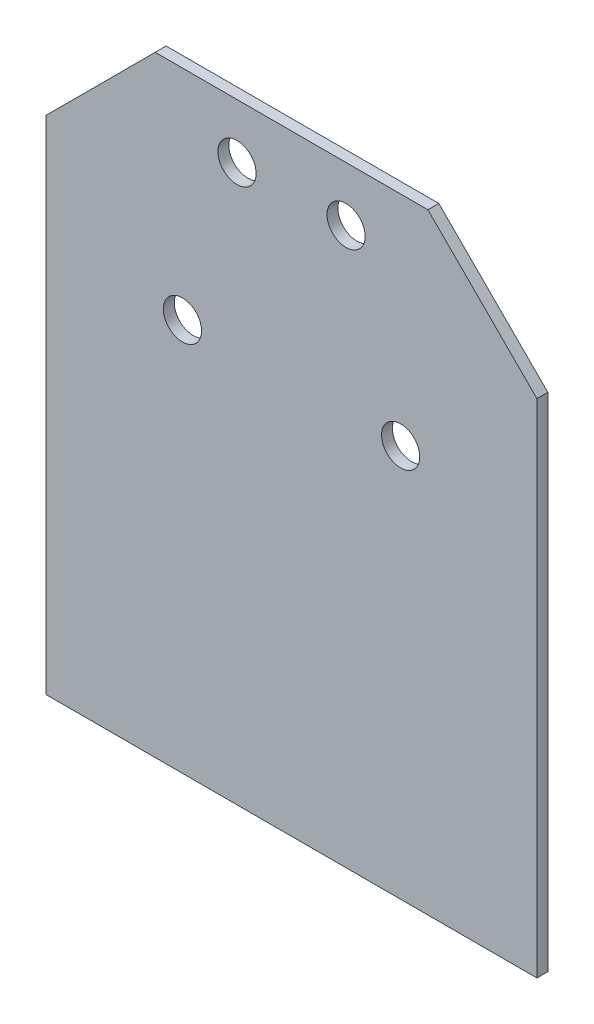
ISO-10303-21;
HEADER;
FILE_DESCRIPTION(('STEP AP214'),'2;1');
FILE_NAME('part.step','',(''),(''),'','','');
FILE_SCHEMA(('AUTOMOTIVE_DESIGN { 1 0 10303 214 1 1 1 1 }'));
ENDSEC;
DATA;
#1=APPLICATION_CONTEXT('core data for automotive mechanical design processes');
#2=APPLICATION_PROTOCOL_DEFINITION('international standard','automotive_design',2000,#1);
#3=PRODUCT_CONTEXT('',#1,'mechanical');
#4=PRODUCT('Part','Part','',(#3));
#5=PRODUCT_RELATED_PRODUCT_CATEGORY('part','',(#4));
#6=PRODUCT_DEFINITION_FORMATION('','',#4);
#7=PRODUCT_DEFINITION_CONTEXT('part definition',#1,'design');
#8=PRODUCT_DEFINITION('design','',#6,#7);
#9=PRODUCT_DEFINITION_SHAPE('','',#8);
#10=(LENGTH_UNIT() NAMED_UNIT(*) SI_UNIT(.MILLI.,.METRE.));
#11=(NAMED_UNIT(*) PLANE_ANGLE_UNIT() SI_UNIT($,.RADIAN.));
#12=(NAMED_UNIT(*) SI_UNIT($,.STERADIAN.) SOLID_ANGLE_UNIT());
#13=UNCERTAINTY_MEASURE_WITH_UNIT(LENGTH_MEASURE(1.E-05),#10,'distance_accuracy_value','');
#14=(GEOMETRIC_REPRESENTATION_CONTEXT(3) GLOBAL_UNCERTAINTY_ASSIGNED_CONTEXT((#13)) GLOBAL_UNIT_ASSIGNED_CONTEXT((#10,
#11,#12)) REPRESENTATION_CONTEXT('',''));
#15=CARTESIAN_POINT('',(0.,0.,0.));
#16=DIRECTION('',(0.,0.,1.));
#17=DIRECTION('',(1.,0.,0.));
#18=AXIS2_PLACEMENT_3D('',#15,#16,#17);
#19=CARTESIAN_POINT('',(-22.5,13.7086402075152,1.));
#20=DIRECTION('',(0.,0.,-1.));
#21=DIRECTION('',(-1.,0.,0.));
#22=AXIS2_PLACEMENT_3D('',#19,#20,#21);
#23=PLANE('',#22);
#24=CARTESIAN_POINT('',(10.,-6.29135979248479,1.));
#25=DIRECTION('',(0.,0.,1.));
#26=DIRECTION('',(1.,0.,0.));
#27=AXIS2_PLACEMENT_3D('',#24,#25,#26);
#28=CIRCLE('',#27,1.75);
#29=CARTESIAN_POINT('',(11.75,-6.29135979248479,1.));
#30=VERTEX_POINT('',#29);
#31=EDGE_CURVE('E197',#30,#30,#28,.T.);
#32=ORIENTED_EDGE('',*,*,#31,.F.);
#33=EDGE_LOOP('',(#32));
#34=FACE_BOUND('',#33,.T.);
#35=CARTESIAN_POINT('',(-4.99999999999999,8.7086402075152,1.));
#36=DIRECTION('',(0.,0.,1.));
#37=DIRECTION('',(1.,0.,0.));
#38=AXIS2_PLACEMENT_3D('',#35,#36,#37);
#39=CIRCLE('',#38,1.75);
#40=CARTESIAN_POINT('',(-3.24999999999999,8.7086402075152,1.));
#41=VERTEX_POINT('',#40);
#42=EDGE_CURVE('E129',#41,#41,#39,.T.);
#43=ORIENTED_EDGE('',*,*,#42,.F.);
#44=EDGE_LOOP('',(#43));
#45=FACE_BOUND('',#44,.T.);
#46=DIRECTION('',(0.,-1.,0.));
#47=VECTOR('',#46,1.);
#48=CARTESIAN_POINT('',(-22.5,-42.2913597924848,1.));
#49=LINE('',#48,#47);
#50=CARTESIAN_POINT('',(-22.5,3.70864020751521,1.));
#51=VERTEX_POINT('',#50);
#52=CARTESIAN_POINT('',(-22.5,-42.2913597924848,1.));
#53=VERTEX_POINT('',#52);
#54=EDGE_CURVE('E136',#51,#53,#49,.T.);
#55=ORIENTED_EDGE('',*,*,#54,.T.);
#56=DIRECTION('',(1.,0.,0.));
#57=VECTOR('',#56,1.);
#58=CARTESIAN_POINT('',(-22.5,-42.2913597924848,1.));
#59=LINE('',#58,#57);
#60=CARTESIAN_POINT('',(22.5,-42.2913597924848,1.));
#61=VERTEX_POINT('',#60);
#62=EDGE_CURVE('E94',#53,#61,#59,.T.);
#63=ORIENTED_EDGE('',*,*,#62,.T.);
#64=DIRECTION('',(0.,1.,0.));
#65=VECTOR('',#64,1.);
#66=CARTESIAN_POINT('',(22.5,-42.2913597924848,1.));
#67=LINE('',#66,#65);
#68=CARTESIAN_POINT('',(22.5,3.70864020751521,1.));
#69=VERTEX_POINT('',#68);
#70=EDGE_CURVE('E107',#61,#69,#67,.T.);
#71=ORIENTED_EDGE('',*,*,#70,.T.);
#72=DIRECTION('',(-0.707106781186548,0.707106781186547,0.));
#73=VECTOR('',#72,1.);
#74=CARTESIAN_POINT('',(12.5,13.7086402075152,1.));
#75=LINE('',#74,#73);
#76=CARTESIAN_POINT('',(12.5,13.7086402075152,1.));
#77=VERTEX_POINT('',#76);
#78=EDGE_CURVE('E101',#69,#77,#75,.T.);
#79=ORIENTED_EDGE('',*,*,#78,.T.);
#80=DIRECTION('',(-1.,0.,0.));
#81=VECTOR('',#80,1.);
#82=CARTESIAN_POINT('',(-12.5,13.7086402075152,1.));
#83=LINE('',#82,#81);
#84=CARTESIAN_POINT('',(-12.5,13.7086402075152,1.));
#85=VERTEX_POINT('',#84);
#86=EDGE_CURVE('E105',#77,#85,#83,.T.);
#87=ORIENTED_EDGE('',*,*,#86,.T.);
#88=DIRECTION('',(-0.707106781186547,-0.707106781186548,0.));
#89=VECTOR('',#88,1.);
#90=CARTESIAN_POINT('',(-22.5,3.70864020751521,1.));
#91=LINE('',#90,#89);
#92=EDGE_CURVE('E57',#85,#51,#91,.T.);
#93=ORIENTED_EDGE('',*,*,#92,.T.);
#94=EDGE_LOOP('',(#55,#63,#71,#79,#87,#93));
#95=FACE_BOUND('',#94,.T.);
#96=CARTESIAN_POINT('',(5.00000000000001,8.7086402075152,1.));
#97=DIRECTION('',(0.,0.,1.));
#98=DIRECTION('',(1.,0.,0.));
#99=AXIS2_PLACEMENT_3D('',#96,#97,#98);
#100=CIRCLE('',#99,1.75);
#101=CARTESIAN_POINT('',(6.75000000000001,8.7086402075152,1.));
#102=VERTEX_POINT('',#101);
#103=EDGE_CURVE('E203',#102,#102,#100,.T.);
#104=ORIENTED_EDGE('',*,*,#103,.F.);
#105=EDGE_LOOP('',(#104));
#106=FACE_BOUND('',#105,.T.);
#107=CARTESIAN_POINT('',(-9.99999999999999,-6.29135979248479,1.));
#108=DIRECTION('',(0.,0.,1.));
#109=DIRECTION('',(1.,0.,0.));
#110=AXIS2_PLACEMENT_3D('',#107,#108,#109);
#111=CIRCLE('',#110,1.75);
#112=CARTESIAN_POINT('',(-8.24999999999999,-6.29135979248479,1.));
#113=VERTEX_POINT('',#112);
#114=EDGE_CURVE('E188',#113,#113,#111,.T.);
#115=ORIENTED_EDGE('',*,*,#114,.F.);
#116=EDGE_LOOP('',(#115));
#117=FACE_BOUND('',#116,.T.);
#118=ADVANCED_FACE('F40',(#34,#45,#95,#106,#117),#23,.F.);
#119=CARTESIAN_POINT('',(-22.5,13.7086402075152,0.));
#120=DIRECTION('',(0.,0.,-1.));
#121=DIRECTION('',(-1.,0.,0.));
#122=AXIS2_PLACEMENT_3D('',#119,#120,#121);
#123=PLANE('',#122);
#124=CARTESIAN_POINT('',(10.,-6.29135979248479,0.));
#125=DIRECTION('',(0.,0.,1.));
#126=DIRECTION('',(1.,0.,0.));
#127=AXIS2_PLACEMENT_3D('',#124,#125,#126);
#128=CIRCLE('',#127,1.75);
#129=CARTESIAN_POINT('',(11.75,-6.29135979248479,0.));
#130=VERTEX_POINT('',#129);
#131=EDGE_CURVE('E194',#130,#130,#128,.T.);
#132=ORIENTED_EDGE('',*,*,#131,.T.);
#133=EDGE_LOOP('',(#132));
#134=FACE_BOUND('',#133,.T.);
#135=CARTESIAN_POINT('',(-4.99999999999999,8.7086402075152,0.));
#136=DIRECTION('',(0.,0.,1.));
#137=DIRECTION('',(1.,0.,0.));
#138=AXIS2_PLACEMENT_3D('',#135,#136,#137);
#139=CIRCLE('',#138,1.75);
#140=CARTESIAN_POINT('',(-3.24999999999999,8.7086402075152,0.));
#141=VERTEX_POINT('',#140);
#142=EDGE_CURVE('E206',#141,#141,#139,.T.);
#143=ORIENTED_EDGE('',*,*,#142,.T.);
#144=EDGE_LOOP('',(#143));
#145=FACE_BOUND('',#144,.T.);
#146=DIRECTION('',(0.,-1.,0.));
#147=VECTOR('',#146,1.);
#148=CARTESIAN_POINT('',(-22.5,-42.2913597924848,0.));
#149=LINE('',#148,#147);
#150=CARTESIAN_POINT('',(-22.5,3.70864020751521,0.));
#151=VERTEX_POINT('',#150);
#152=CARTESIAN_POINT('',(-22.5,-42.2913597924848,0.));
#153=VERTEX_POINT('',#152);
#154=EDGE_CURVE('E125',#151,#153,#149,.T.);
#155=ORIENTED_EDGE('',*,*,#154,.F.);
#156=DIRECTION('',(-0.707106781186547,-0.707106781186548,0.));
#157=VECTOR('',#156,1.);
#158=CARTESIAN_POINT('',(-22.5,3.70864020751521,0.));
#159=LINE('',#158,#157);
#160=CARTESIAN_POINT('',(-12.5,13.7086402075152,0.));
#161=VERTEX_POINT('',#160);
#162=EDGE_CURVE('E86',#161,#151,#159,.T.);
#163=ORIENTED_EDGE('',*,*,#162,.F.);
#164=DIRECTION('',(-1.,0.,0.));
#165=VECTOR('',#164,1.);
#166=CARTESIAN_POINT('',(-12.5,13.7086402075152,0.));
#167=LINE('',#166,#165);
#168=CARTESIAN_POINT('',(12.5,13.7086402075152,0.));
#169=VERTEX_POINT('',#168);
#170=EDGE_CURVE('E80',#169,#161,#167,.T.);
#171=ORIENTED_EDGE('',*,*,#170,.F.);
#172=DIRECTION('',(-0.707106781186548,0.707106781186547,0.));
#173=VECTOR('',#172,1.);
#174=CARTESIAN_POINT('',(12.5,13.7086402075152,0.));
#175=LINE('',#174,#173);
#176=CARTESIAN_POINT('',(22.5,3.70864020751521,0.));
#177=VERTEX_POINT('',#176);
#178=EDGE_CURVE('E115',#177,#169,#175,.T.);
#179=ORIENTED_EDGE('',*,*,#178,.F.);
#180=DIRECTION('',(0.,1.,0.));
#181=VECTOR('',#180,1.);
#182=CARTESIAN_POINT('',(22.5,-42.2913597924848,0.));
#183=LINE('',#182,#181);
#184=CARTESIAN_POINT('',(22.5,-42.2913597924848,0.));
#185=VERTEX_POINT('',#184);
#186=EDGE_CURVE('E131',#185,#177,#183,.T.);
#187=ORIENTED_EDGE('',*,*,#186,.F.);
#188=DIRECTION('',(1.,0.,0.));
#189=VECTOR('',#188,1.);
#190=CARTESIAN_POINT('',(-22.5,-42.2913597924848,0.));
#191=LINE('',#190,#189);
#192=EDGE_CURVE('E128',#153,#185,#191,.T.);
#193=ORIENTED_EDGE('',*,*,#192,.F.);
#194=EDGE_LOOP('',(#155,#163,#171,#179,#187,#193));
#195=FACE_BOUND('',#194,.T.);
#196=CARTESIAN_POINT('',(5.00000000000001,8.7086402075152,0.));
#197=DIRECTION('',(0.,0.,1.));
#198=DIRECTION('',(1.,0.,0.));
#199=AXIS2_PLACEMENT_3D('',#196,#197,#198);
#200=CIRCLE('',#199,1.75);
#201=CARTESIAN_POINT('',(6.75000000000001,8.7086402075152,0.));
#202=VERTEX_POINT('',#201);
#203=EDGE_CURVE('E200',#202,#202,#200,.T.);
#204=ORIENTED_EDGE('',*,*,#203,.T.);
#205=EDGE_LOOP('',(#204));
#206=FACE_BOUND('',#205,.T.);
#207=CARTESIAN_POINT('',(-9.99999999999999,-6.29135979248479,0.));
#208=DIRECTION('',(0.,0.,1.));
#209=DIRECTION('',(1.,0.,0.));
#210=AXIS2_PLACEMENT_3D('',#207,#208,#209);
#211=CIRCLE('',#210,1.75);
#212=CARTESIAN_POINT('',(-8.24999999999999,-6.29135979248479,0.));
#213=VERTEX_POINT('',#212);
#214=EDGE_CURVE('E191',#213,#213,#211,.T.);
#215=ORIENTED_EDGE('',*,*,#214,.T.);
#216=EDGE_LOOP('',(#215));
#217=FACE_BOUND('',#216,.T.);
#218=ADVANCED_FACE('F145',(#134,#145,#195,#206,#217),#123,.T.);
#219=CARTESIAN_POINT('',(-22.5,-42.2913597924848,1.));
#220=DIRECTION('',(1.,0.,0.));
#221=DIRECTION('',(0.,0.,-1.));
#222=AXIS2_PLACEMENT_3D('',#219,#220,#221);
#223=PLANE('',#222);
#224=ORIENTED_EDGE('',*,*,#154,.T.);
#225=DIRECTION('',(0.,0.,-1.));
#226=VECTOR('',#225,1.);
#227=CARTESIAN_POINT('',(-22.5,-42.2913597924848,1.));
#228=LINE('',#227,#226);
#229=EDGE_CURVE('E13',#53,#153,#228,.T.);
#230=ORIENTED_EDGE('',*,*,#229,.F.);
#231=ORIENTED_EDGE('',*,*,#54,.F.);
#232=DIRECTION('',(0.,0.,-1.));
#233=VECTOR('',#232,1.);
#234=CARTESIAN_POINT('',(-22.5,3.70864020751521,1.));
#235=LINE('',#234,#233);
#236=EDGE_CURVE('E121',#51,#151,#235,.T.);
#237=ORIENTED_EDGE('',*,*,#236,.T.);
#238=EDGE_LOOP('',(#224,#230,#231,#237));
#239=FACE_BOUND('',#238,.T.);
#240=ADVANCED_FACE('F42',(#239),#223,.F.);
#241=CARTESIAN_POINT('',(-22.5,-42.2913597924848,1.));
#242=DIRECTION('',(0.,1.,0.));
#243=DIRECTION('',(0.,0.,1.));
#244=AXIS2_PLACEMENT_3D('',#241,#242,#243);
#245=PLANE('',#244);
#246=ORIENTED_EDGE('',*,*,#192,.T.);
#247=DIRECTION('',(0.,0.,-1.));
#248=VECTOR('',#247,1.);
#249=CARTESIAN_POINT('',(22.5,-42.2913597924848,1.));
#250=LINE('',#249,#248);
#251=EDGE_CURVE('E49',#61,#185,#250,.T.);
#252=ORIENTED_EDGE('',*,*,#251,.F.);
#253=ORIENTED_EDGE('',*,*,#62,.F.);
#254=ORIENTED_EDGE('',*,*,#229,.T.);
#255=EDGE_LOOP('',(#246,#252,#253,#254));
#256=FACE_BOUND('',#255,.T.);
#257=ADVANCED_FACE('F263',(#256),#245,.F.);
#258=CARTESIAN_POINT('',(22.5,-42.2913597924848,1.));
#259=DIRECTION('',(-1.,0.,0.));
#260=DIRECTION('',(0.,0.,1.));
#261=AXIS2_PLACEMENT_3D('',#258,#259,#260);
#262=PLANE('',#261);
#263=ORIENTED_EDGE('',*,*,#186,.T.);
#264=DIRECTION('',(0.,0.,-1.));
#265=VECTOR('',#264,1.);
#266=CARTESIAN_POINT('',(22.5,3.70864020751521,1.));
#267=LINE('',#266,#265);
#268=EDGE_CURVE('E116',#69,#177,#267,.T.);
#269=ORIENTED_EDGE('',*,*,#268,.F.);
#270=ORIENTED_EDGE('',*,*,#70,.F.);
#271=ORIENTED_EDGE('',*,*,#251,.T.);
#272=EDGE_LOOP('',(#263,#269,#270,#271));
#273=FACE_BOUND('',#272,.T.);
#274=ADVANCED_FACE('F142',(#273),#262,.F.);
#275=CARTESIAN_POINT('',(12.5,13.7086402075152,1.));
#276=DIRECTION('',(-0.707106781186547,-0.707106781186548,0.));
#277=DIRECTION('',(0.707106781186548,-0.707106781186547,0.));
#278=AXIS2_PLACEMENT_3D('',#275,#276,#277);
#279=PLANE('',#278);
#280=ORIENTED_EDGE('',*,*,#178,.T.);
#281=DIRECTION('',(0.,0.,-1.));
#282=VECTOR('',#281,1.);
#283=CARTESIAN_POINT('',(12.5,13.7086402075152,1.));
#284=LINE('',#283,#282);
#285=EDGE_CURVE('E112',#77,#169,#284,.T.);
#286=ORIENTED_EDGE('',*,*,#285,.F.);
#287=ORIENTED_EDGE('',*,*,#78,.F.);
#288=ORIENTED_EDGE('',*,*,#268,.T.);
#289=EDGE_LOOP('',(#280,#286,#287,#288));
#290=FACE_BOUND('',#289,.T.);
#291=ADVANCED_FACE('F113',(#290),#279,.F.);
#292=CARTESIAN_POINT('',(-12.5,13.7086402075152,1.));
#293=DIRECTION('',(0.,-1.,0.));
#294=DIRECTION('',(0.,0.,-1.));
#295=AXIS2_PLACEMENT_3D('',#292,#293,#294);
#296=PLANE('',#295);
#297=ORIENTED_EDGE('',*,*,#170,.T.);
#298=DIRECTION('',(0.,0.,-1.));
#299=VECTOR('',#298,1.);
#300=CARTESIAN_POINT('',(-12.5,13.7086402075152,1.));
#301=LINE('',#300,#299);
#302=EDGE_CURVE('E117',#85,#161,#301,.T.);
#303=ORIENTED_EDGE('',*,*,#302,.F.);
#304=ORIENTED_EDGE('',*,*,#86,.F.);
#305=ORIENTED_EDGE('',*,*,#285,.T.);
#306=EDGE_LOOP('',(#297,#303,#304,#305));
#307=FACE_BOUND('',#306,.T.);
#308=ADVANCED_FACE('F119',(#307),#296,.F.);
#309=CARTESIAN_POINT('',(-22.5,3.70864020751521,1.));
#310=DIRECTION('',(0.707106781186548,-0.707106781186547,0.));
#311=DIRECTION('',(0.707106781186547,0.707106781186548,0.));
#312=AXIS2_PLACEMENT_3D('',#309,#310,#311);
#313=PLANE('',#312);
#314=ORIENTED_EDGE('',*,*,#162,.T.);
#315=ORIENTED_EDGE('',*,*,#236,.F.);
#316=ORIENTED_EDGE('',*,*,#92,.F.);
#317=ORIENTED_EDGE('',*,*,#302,.T.);
#318=EDGE_LOOP('',(#314,#315,#316,#317));
#319=FACE_BOUND('',#318,.T.);
#320=ADVANCED_FACE('F150',(#319),#313,.F.);
#321=CARTESIAN_POINT('',(-4.99999999999999,8.7086402075152,1.));
#322=DIRECTION('',(0.,0.,-1.));
#323=DIRECTION('',(-1.,0.,0.));
#324=AXIS2_PLACEMENT_3D('',#321,#322,#323);
#325=CYLINDRICAL_SURFACE('',#324,1.75);
#326=ORIENTED_EDGE('',*,*,#42,.T.);
#327=EDGE_LOOP('',(#326));
#328=FACE_BOUND('',#327,.T.);
#329=ORIENTED_EDGE('',*,*,#142,.F.);
#330=EDGE_LOOP('',(#329));
#331=FACE_BOUND('',#330,.T.);
#332=ADVANCED_FACE('F152',(#328,#331),#325,.F.);
#333=CARTESIAN_POINT('',(5.00000000000001,8.7086402075152,1.));
#334=DIRECTION('',(0.,0.,-1.));
#335=DIRECTION('',(-1.,0.,0.));
#336=AXIS2_PLACEMENT_3D('',#333,#334,#335);
#337=CYLINDRICAL_SURFACE('',#336,1.75);
#338=ORIENTED_EDGE('',*,*,#103,.T.);
#339=EDGE_LOOP('',(#338));
#340=FACE_BOUND('',#339,.T.);
#341=ORIENTED_EDGE('',*,*,#203,.F.);
#342=EDGE_LOOP('',(#341));
#343=FACE_BOUND('',#342,.T.);
#344=ADVANCED_FACE('F158',(#340,#343),#337,.F.);
#345=CARTESIAN_POINT('',(10.,-6.29135979248479,1.));
#346=DIRECTION('',(0.,0.,-1.));
#347=DIRECTION('',(-1.,0.,0.));
#348=AXIS2_PLACEMENT_3D('',#345,#346,#347);
#349=CYLINDRICAL_SURFACE('',#348,1.75);
#350=ORIENTED_EDGE('',*,*,#31,.T.);
#351=EDGE_LOOP('',(#350));
#352=FACE_BOUND('',#351,.T.);
#353=ORIENTED_EDGE('',*,*,#131,.F.);
#354=EDGE_LOOP('',(#353));
#355=FACE_BOUND('',#354,.T.);
#356=ADVANCED_FACE('F175',(#352,#355),#349,.F.);
#357=CARTESIAN_POINT('',(-9.99999999999999,-6.29135979248479,1.));
#358=DIRECTION('',(0.,0.,-1.));
#359=DIRECTION('',(-1.,0.,0.));
#360=AXIS2_PLACEMENT_3D('',#357,#358,#359);
#361=CYLINDRICAL_SURFACE('',#360,1.75);
#362=ORIENTED_EDGE('',*,*,#114,.T.);
#363=EDGE_LOOP('',(#362));
#364=FACE_BOUND('',#363,.T.);
#365=ORIENTED_EDGE('',*,*,#214,.F.);
#366=EDGE_LOOP('',(#365));
#367=FACE_BOUND('',#366,.T.);
#368=ADVANCED_FACE('F179',(#364,#367),#361,.F.);
#369=CLOSED_SHELL('',(#118,#218,#240,#257,#274,#291,#308,#320,#332,#344,#356,#368));
#370=MANIFOLD_SOLID_BREP('B2',#369);
#371=ADVANCED_BREP_SHAPE_REPRESENTATION('',(#18,#370),#14);
#372=SHAPE_DEFINITION_REPRESENTATION(#9,#371);
ENDSEC;
END-ISO-10303-21;
